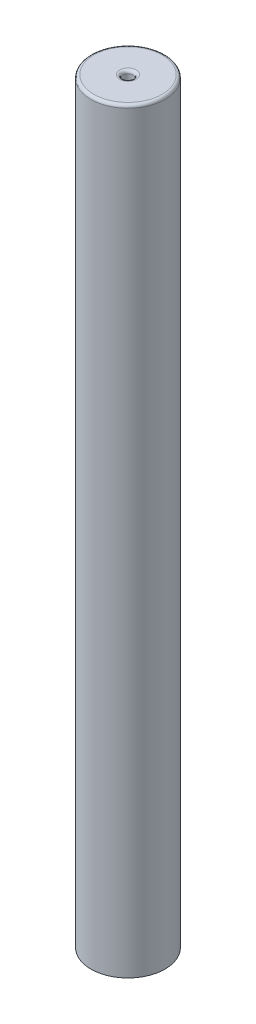
ISO-10303-21;
HEADER;
FILE_DESCRIPTION(('STEP AP214'),'2;1');
FILE_NAME('part.step','',(''),(''),'','','');
FILE_SCHEMA(('AUTOMOTIVE_DESIGN { 1 0 10303 214 1 1 1 1 }'));
ENDSEC;
DATA;
#1=APPLICATION_CONTEXT('core data for automotive mechanical design processes');
#2=APPLICATION_PROTOCOL_DEFINITION('international standard','automotive_design',2000,#1);
#3=PRODUCT_CONTEXT('',#1,'mechanical');
#4=PRODUCT('Part','Part','',(#3));
#5=PRODUCT_RELATED_PRODUCT_CATEGORY('part','',(#4));
#6=PRODUCT_DEFINITION_FORMATION('','',#4);
#7=PRODUCT_DEFINITION_CONTEXT('part definition',#1,'design');
#8=PRODUCT_DEFINITION('design','',#6,#7);
#9=PRODUCT_DEFINITION_SHAPE('','',#8);
#10=(LENGTH_UNIT() NAMED_UNIT(*) SI_UNIT(.MILLI.,.METRE.));
#11=(NAMED_UNIT(*) PLANE_ANGLE_UNIT() SI_UNIT($,.RADIAN.));
#12=(NAMED_UNIT(*) SI_UNIT($,.STERADIAN.) SOLID_ANGLE_UNIT());
#13=UNCERTAINTY_MEASURE_WITH_UNIT(LENGTH_MEASURE(1.E-05),#10,'distance_accuracy_value','');
#14=(GEOMETRIC_REPRESENTATION_CONTEXT(3) GLOBAL_UNCERTAINTY_ASSIGNED_CONTEXT((#13)) GLOBAL_UNIT_ASSIGNED_CONTEXT((#10,
#11,#12)) REPRESENTATION_CONTEXT('',''));
#15=CARTESIAN_POINT('',(0.,0.,0.));
#16=DIRECTION('',(0.,0.,1.));
#17=DIRECTION('',(1.,0.,0.));
#18=AXIS2_PLACEMENT_3D('',#15,#16,#17);
#19=CARTESIAN_POINT('',(0.,510.,0.));
#20=DIRECTION('',(0.,-1.,0.));
#21=DIRECTION('',(0.,0.,-1.));
#22=AXIS2_PLACEMENT_3D('',#19,#20,#21);
#23=CYLINDRICAL_SURFACE('',#22,25.);
#24=CARTESIAN_POINT('',(0.,508.,0.));
#25=DIRECTION('',(0.,1.,0.));
#26=DIRECTION('',(0.,0.,1.));
#27=AXIS2_PLACEMENT_3D('',#24,#25,#26);
#28=CIRCLE('',#27,25.);
#29=CARTESIAN_POINT('',(0.,508.,25.));
#30=VERTEX_POINT('',#29);
#31=EDGE_CURVE('E10',#30,#30,#28,.F.);
#32=ORIENTED_EDGE('',*,*,#31,.T.);
#33=EDGE_LOOP('',(#32));
#34=FACE_BOUND('',#33,.T.);
#35=CARTESIAN_POINT('',(0.,0.,0.));
#36=DIRECTION('',(0.,1.,0.));
#37=DIRECTION('',(0.,0.,1.));
#38=AXIS2_PLACEMENT_3D('',#35,#36,#37);
#39=CIRCLE('',#38,25.);
#40=CARTESIAN_POINT('',(0.,0.,25.));
#41=VERTEX_POINT('',#40);
#42=EDGE_CURVE('E53',#41,#41,#39,.T.);
#43=ORIENTED_EDGE('',*,*,#42,.T.);
#44=EDGE_LOOP('',(#43));
#45=FACE_BOUND('',#44,.T.);
#46=ADVANCED_FACE('F33',(#34,#45),#23,.T.);
#47=CARTESIAN_POINT('',(0.,510.,0.));
#48=DIRECTION('',(0.,1.,0.));
#49=DIRECTION('',(0.,0.,1.));
#50=AXIS2_PLACEMENT_3D('',#47,#48,#49);
#51=PLANE('',#50);
#52=CARTESIAN_POINT('',(0.,510.,0.));
#53=DIRECTION('',(0.,1.,0.));
#54=DIRECTION('',(0.,0.,1.));
#55=AXIS2_PLACEMENT_3D('',#52,#53,#54);
#56=CIRCLE('',#55,5.5);
#57=CARTESIAN_POINT('',(0.,510.,5.5));
#58=VERTEX_POINT('',#57);
#59=EDGE_CURVE('E40',#58,#58,#56,.F.);
#60=ORIENTED_EDGE('',*,*,#59,.T.);
#61=EDGE_LOOP('',(#60));
#62=FACE_BOUND('',#61,.T.);
#63=CARTESIAN_POINT('',(0.,510.,0.));
#64=DIRECTION('',(0.,1.,0.));
#65=DIRECTION('',(0.,0.,1.));
#66=AXIS2_PLACEMENT_3D('',#63,#64,#65);
#67=CIRCLE('',#66,23.);
#68=CARTESIAN_POINT('',(0.,510.,23.));
#69=VERTEX_POINT('',#68);
#70=EDGE_CURVE('E44',#69,#69,#67,.T.);
#71=ORIENTED_EDGE('',*,*,#70,.T.);
#72=EDGE_LOOP('',(#71));
#73=FACE_BOUND('',#72,.T.);
#74=ADVANCED_FACE('F73',(#62,#73),#51,.T.);
#75=CARTESIAN_POINT('',(0.,0.,0.));
#76=DIRECTION('',(0.,1.,0.));
#77=DIRECTION('',(0.,0.,1.));
#78=AXIS2_PLACEMENT_3D('',#75,#76,#77);
#79=PLANE('',#78);
#80=ORIENTED_EDGE('',*,*,#42,.F.);
#81=EDGE_LOOP('',(#80));
#82=FACE_BOUND('',#81,.T.);
#83=ADVANCED_FACE('F64',(#82),#79,.F.);
#84=CARTESIAN_POINT('',(0.,480.,0.));
#85=DIRECTION('',(0.,1.,0.));
#86=DIRECTION('',(0.,0.,1.));
#87=AXIS2_PLACEMENT_3D('',#84,#85,#86);
#88=CYLINDRICAL_SURFACE('',#87,3.5);
#89=CARTESIAN_POINT('',(0.,508.,0.));
#90=DIRECTION('',(0.,1.,0.));
#91=DIRECTION('',(0.,0.,1.));
#92=AXIS2_PLACEMENT_3D('',#89,#90,#91);
#93=CIRCLE('',#92,3.5);
#94=CARTESIAN_POINT('',(0.,508.,3.5));
#95=VERTEX_POINT('',#94);
#96=EDGE_CURVE('E48',#95,#95,#93,.T.);
#97=ORIENTED_EDGE('',*,*,#96,.T.);
#98=EDGE_LOOP('',(#97));
#99=FACE_BOUND('',#98,.T.);
#100=CARTESIAN_POINT('',(0.,480.,0.));
#101=DIRECTION('',(0.,1.,0.));
#102=DIRECTION('',(0.,0.,1.));
#103=AXIS2_PLACEMENT_3D('',#100,#101,#102);
#104=CIRCLE('',#103,3.5);
#105=CARTESIAN_POINT('',(0.,480.,3.5));
#106=VERTEX_POINT('',#105);
#107=EDGE_CURVE('E56',#106,#106,#104,.T.);
#108=ORIENTED_EDGE('',*,*,#107,.F.);
#109=EDGE_LOOP('',(#108));
#110=FACE_BOUND('',#109,.T.);
#111=ADVANCED_FACE('F62',(#99,#110),#88,.F.);
#112=CARTESIAN_POINT('',(0.,480.,0.));
#113=DIRECTION('',(0.,1.,0.));
#114=DIRECTION('',(0.,0.,1.));
#115=AXIS2_PLACEMENT_3D('',#112,#113,#114);
#116=PLANE('',#115);
#117=ORIENTED_EDGE('',*,*,#107,.T.);
#118=EDGE_LOOP('',(#117));
#119=FACE_BOUND('',#118,.T.);
#120=ADVANCED_FACE('F60',(#119),#116,.T.);
#121=CARTESIAN_POINT('',(0.,508.,0.));
#122=DIRECTION('',(0.,1.,0.));
#123=DIRECTION('',(0.,0.,1.));
#124=AXIS2_PLACEMENT_3D('',#121,#122,#123);
#125=TOROIDAL_SURFACE('',#124,5.5,2.);
#126=ORIENTED_EDGE('',*,*,#59,.F.);
#127=EDGE_LOOP('',(#126));
#128=FACE_BOUND('',#127,.T.);
#129=ORIENTED_EDGE('',*,*,#96,.F.);
#130=EDGE_LOOP('',(#129));
#131=FACE_BOUND('',#130,.T.);
#132=ADVANCED_FACE('F71',(#128,#131),#125,.T.);
#133=CARTESIAN_POINT('',(0.,508.,0.));
#134=DIRECTION('',(0.,1.,0.));
#135=DIRECTION('',(0.,0.,1.));
#136=AXIS2_PLACEMENT_3D('',#133,#134,#135);
#137=TOROIDAL_SURFACE('',#136,23.,2.);
#138=ORIENTED_EDGE('',*,*,#31,.F.);
#139=EDGE_LOOP('',(#138));
#140=FACE_BOUND('',#139,.T.);
#141=ORIENTED_EDGE('',*,*,#70,.F.);
#142=EDGE_LOOP('',(#141));
#143=FACE_BOUND('',#142,.T.);
#144=ADVANCED_FACE('F35',(#140,#143),#137,.T.);
#145=CLOSED_SHELL('',(#46,#74,#83,#111,#120,#132,#144));
#146=MANIFOLD_SOLID_BREP('B2',#145);
#147=ADVANCED_BREP_SHAPE_REPRESENTATION('',(#18,#146),#14);
#148=SHAPE_DEFINITION_REPRESENTATION(#9,#147);
ENDSEC;
END-ISO-10303-21;
